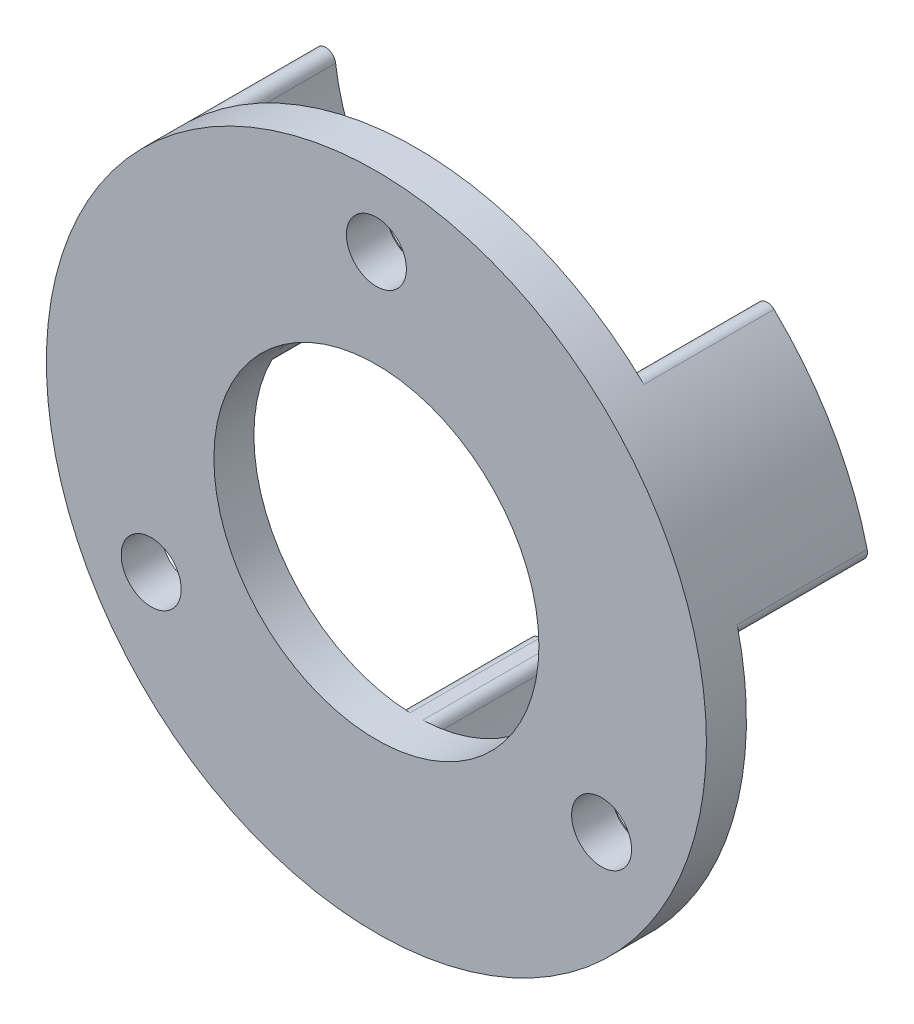
ISO-10303-21;
HEADER;
FILE_DESCRIPTION(('STEP AP214'),'2;1');
FILE_NAME('part.step','',(''),(''),'','','');
FILE_SCHEMA(('AUTOMOTIVE_DESIGN { 1 0 10303 214 1 1 1 1 }'));
ENDSEC;
DATA;
#1=APPLICATION_CONTEXT('core data for automotive mechanical design processes');
#2=APPLICATION_PROTOCOL_DEFINITION('international standard','automotive_design',2000,#1);
#3=PRODUCT_CONTEXT('',#1,'mechanical');
#4=PRODUCT('Part','Part','',(#3));
#5=PRODUCT_RELATED_PRODUCT_CATEGORY('part','',(#4));
#6=PRODUCT_DEFINITION_FORMATION('','',#4);
#7=PRODUCT_DEFINITION_CONTEXT('part definition',#1,'design');
#8=PRODUCT_DEFINITION('design','',#6,#7);
#9=PRODUCT_DEFINITION_SHAPE('','',#8);
#10=(LENGTH_UNIT() NAMED_UNIT(*) SI_UNIT(.MILLI.,.METRE.));
#11=(NAMED_UNIT(*) PLANE_ANGLE_UNIT() SI_UNIT($,.RADIAN.));
#12=(NAMED_UNIT(*) SI_UNIT($,.STERADIAN.) SOLID_ANGLE_UNIT());
#13=UNCERTAINTY_MEASURE_WITH_UNIT(LENGTH_MEASURE(1.E-05),#10,'distance_accuracy_value','');
#14=(GEOMETRIC_REPRESENTATION_CONTEXT(3) GLOBAL_UNCERTAINTY_ASSIGNED_CONTEXT((#13)) GLOBAL_UNIT_ASSIGNED_CONTEXT((#10,
#11,#12)) REPRESENTATION_CONTEXT('',''));
#15=CARTESIAN_POINT('',(0.,0.,0.));
#16=DIRECTION('',(0.,0.,1.));
#17=DIRECTION('',(1.,0.,0.));
#18=AXIS2_PLACEMENT_3D('',#15,#16,#17);
#19=CARTESIAN_POINT('',(0.,-8.95,13.));
#20=DIRECTION('',(0.,0.,-1.));
#21=DIRECTION('',(0.,-1.,0.));
#22=AXIS2_PLACEMENT_3D('',#19,#20,#21);
#23=PLANE('',#22);
#24=CARTESIAN_POINT('',(0.,-26.,13.));
#25=DIRECTION('',(0.,0.,-1.));
#26=DIRECTION('',(-1.,0.,0.));
#27=AXIS2_PLACEMENT_3D('',#24,#25,#26);
#28=CIRCLE('',#27,2.1);
#29=CARTESIAN_POINT('',(-2.1,-26.,13.));
#30=VERTEX_POINT('',#29);
#31=EDGE_CURVE('E11',#30,#30,#28,.T.);
#32=ORIENTED_EDGE('',*,*,#31,.T.);
#33=EDGE_LOOP('',(#32));
#34=FACE_BOUND('',#33,.T.);
#35=ADVANCED_FACE('F17',(#34),#23,.T.);
#36=CARTESIAN_POINT('',(0.,-26.,13.));
#37=DIRECTION('',(0.,0.,-1.));
#38=DIRECTION('',(-1.,0.,0.));
#39=AXIS2_PLACEMENT_3D('',#36,#37,#38);
#40=CYLINDRICAL_SURFACE('',#39,2.1);
#41=CARTESIAN_POINT('',(0.,-26.,5.));
#42=DIRECTION('',(0.,0.,-1.));
#43=DIRECTION('',(-1.,0.,0.));
#44=AXIS2_PLACEMENT_3D('',#41,#42,#43);
#45=CIRCLE('',#44,2.1);
#46=CARTESIAN_POINT('',(-2.1,-26.,5.));
#47=VERTEX_POINT('',#46);
#48=EDGE_CURVE('E293',#47,#47,#45,.T.);
#49=ORIENTED_EDGE('',*,*,#48,.T.);
#50=EDGE_LOOP('',(#49));
#51=FACE_BOUND('',#50,.T.);
#52=ORIENTED_EDGE('',*,*,#31,.F.);
#53=EDGE_LOOP('',(#52));
#54=FACE_BOUND('',#53,.T.);
#55=ADVANCED_FACE('F755',(#51,#54),#40,.F.);
#56=CARTESIAN_POINT('',(0.,-8.95,13.));
#57=DIRECTION('',(0.,0.,-1.));
#58=DIRECTION('',(0.,-1.,0.));
#59=AXIS2_PLACEMENT_3D('',#56,#57,#58);
#60=PLANE('',#59);
#61=CARTESIAN_POINT('',(-22.5166604983954,13.,13.));
#62=DIRECTION('',(0.,0.,-1.));
#63=DIRECTION('',(-1.,0.,0.));
#64=AXIS2_PLACEMENT_3D('',#61,#62,#63);
#65=CIRCLE('',#64,2.1);
#66=CARTESIAN_POINT('',(-24.6166604983954,13.,13.));
#67=VERTEX_POINT('',#66);
#68=EDGE_CURVE('E27',#67,#67,#65,.T.);
#69=ORIENTED_EDGE('',*,*,#68,.T.);
#70=EDGE_LOOP('',(#69));
#71=FACE_BOUND('',#70,.T.);
#72=ADVANCED_FACE('F761',(#71),#60,.T.);
#73=CARTESIAN_POINT('',(-22.5166604983954,13.,13.));
#74=DIRECTION('',(0.,0.,-1.));
#75=DIRECTION('',(-1.,0.,0.));
#76=AXIS2_PLACEMENT_3D('',#73,#74,#75);
#77=CYLINDRICAL_SURFACE('',#76,2.1);
#78=CARTESIAN_POINT('',(-22.5166604983954,13.,5.));
#79=DIRECTION('',(0.,0.,-1.));
#80=DIRECTION('',(-1.,0.,0.));
#81=AXIS2_PLACEMENT_3D('',#78,#79,#80);
#82=CIRCLE('',#81,2.1);
#83=CARTESIAN_POINT('',(-24.6166604983954,13.,5.));
#84=VERTEX_POINT('',#83);
#85=EDGE_CURVE('E462',#84,#84,#82,.T.);
#86=ORIENTED_EDGE('',*,*,#85,.T.);
#87=EDGE_LOOP('',(#86));
#88=FACE_BOUND('',#87,.T.);
#89=ORIENTED_EDGE('',*,*,#68,.F.);
#90=EDGE_LOOP('',(#89));
#91=FACE_BOUND('',#90,.T.);
#92=ADVANCED_FACE('F825',(#88,#91),#77,.F.);
#93=CARTESIAN_POINT('',(0.,-8.95,13.));
#94=DIRECTION('',(0.,0.,-1.));
#95=DIRECTION('',(0.,-1.,0.));
#96=AXIS2_PLACEMENT_3D('',#93,#94,#95);
#97=PLANE('',#96);
#98=CARTESIAN_POINT('',(22.5166604983954,13.,13.));
#99=DIRECTION('',(0.,0.,-1.));
#100=DIRECTION('',(-1.,0.,0.));
#101=AXIS2_PLACEMENT_3D('',#98,#99,#100);
#102=CIRCLE('',#101,2.1);
#103=CARTESIAN_POINT('',(20.4166604983954,13.,13.));
#104=VERTEX_POINT('',#103);
#105=EDGE_CURVE('E611',#104,#104,#102,.T.);
#106=ORIENTED_EDGE('',*,*,#105,.T.);
#107=EDGE_LOOP('',(#106));
#108=FACE_BOUND('',#107,.T.);
#109=ADVANCED_FACE('F839',(#108),#97,.T.);
#110=CARTESIAN_POINT('',(22.5166604983954,13.,13.));
#111=DIRECTION('',(0.,0.,-1.));
#112=DIRECTION('',(-1.,0.,0.));
#113=AXIS2_PLACEMENT_3D('',#110,#111,#112);
#114=CYLINDRICAL_SURFACE('',#113,2.1);
#115=CARTESIAN_POINT('',(22.5166604983954,13.,5.));
#116=DIRECTION('',(0.,0.,-1.));
#117=DIRECTION('',(-1.,0.,0.));
#118=AXIS2_PLACEMENT_3D('',#115,#116,#117);
#119=CIRCLE('',#118,2.1);
#120=CARTESIAN_POINT('',(20.4166604983954,13.,5.));
#121=VERTEX_POINT('',#120);
#122=EDGE_CURVE('E97',#121,#121,#119,.T.);
#123=ORIENTED_EDGE('',*,*,#122,.T.);
#124=EDGE_LOOP('',(#123));
#125=FACE_BOUND('',#124,.T.);
#126=ORIENTED_EDGE('',*,*,#105,.F.);
#127=EDGE_LOOP('',(#126));
#128=FACE_BOUND('',#127,.T.);
#129=ADVANCED_FACE('F797',(#125,#128),#114,.F.);
#130=CARTESIAN_POINT('',(0.,0.,22.));
#131=DIRECTION('',(0.,0.,1.));
#132=DIRECTION('',(1.,0.,0.));
#133=AXIS2_PLACEMENT_3D('',#130,#131,#132);
#134=PLANE('',#133);
#135=CARTESIAN_POINT('',(-22.5166604983954,-13.,22.));
#136=DIRECTION('',(0.,0.,1.));
#137=DIRECTION('',(1.,0.,0.));
#138=AXIS2_PLACEMENT_3D('',#135,#136,#137);
#139=CIRCLE('',#138,3.);
#140=CARTESIAN_POINT('',(-19.5166604983954,-13.,22.));
#141=VERTEX_POINT('',#140);
#142=EDGE_CURVE('E528',#141,#141,#139,.T.);
#143=ORIENTED_EDGE('',*,*,#142,.F.);
#144=EDGE_LOOP('',(#143));
#145=FACE_BOUND('',#144,.T.);
#146=CARTESIAN_POINT('',(0.,26.,22.));
#147=DIRECTION('',(0.,0.,1.));
#148=DIRECTION('',(1.,0.,0.));
#149=AXIS2_PLACEMENT_3D('',#146,#147,#148);
#150=CIRCLE('',#149,3.);
#151=CARTESIAN_POINT('',(3.,26.,22.));
#152=VERTEX_POINT('',#151);
#153=EDGE_CURVE('E84',#152,#152,#150,.T.);
#154=ORIENTED_EDGE('',*,*,#153,.F.);
#155=EDGE_LOOP('',(#154));
#156=FACE_BOUND('',#155,.T.);
#157=CARTESIAN_POINT('',(22.5166604983954,-13.,22.));
#158=DIRECTION('',(0.,0.,1.));
#159=DIRECTION('',(1.,0.,0.));
#160=AXIS2_PLACEMENT_3D('',#157,#158,#159);
#161=CIRCLE('',#160,3.);
#162=CARTESIAN_POINT('',(25.5166604983954,-13.,22.));
#163=VERTEX_POINT('',#162);
#164=EDGE_CURVE('E418',#163,#163,#161,.T.);
#165=ORIENTED_EDGE('',*,*,#164,.F.);
#166=EDGE_LOOP('',(#165));
#167=FACE_BOUND('',#166,.T.);
#168=CARTESIAN_POINT('',(0.,0.,22.));
#169=DIRECTION('',(0.,0.,1.));
#170=DIRECTION('',(1.,0.,0.));
#171=AXIS2_PLACEMENT_3D('',#168,#169,#170);
#172=CIRCLE('',#171,16.25);
#173=CARTESIAN_POINT('',(16.25,0.,22.));
#174=VERTEX_POINT('',#173);
#175=EDGE_CURVE('E437',#174,#174,#172,.T.);
#176=ORIENTED_EDGE('',*,*,#175,.F.);
#177=EDGE_LOOP('',(#176));
#178=FACE_BOUND('',#177,.T.);
#179=CARTESIAN_POINT('',(0.,0.,22.));
#180=DIRECTION('',(0.,0.,1.));
#181=DIRECTION('',(1.,0.,0.));
#182=AXIS2_PLACEMENT_3D('',#179,#180,#181);
#183=CIRCLE('',#182,33.);
#184=CARTESIAN_POINT('',(33.,0.,22.));
#185=VERTEX_POINT('',#184);
#186=EDGE_CURVE('E515',#185,#185,#183,.T.);
#187=ORIENTED_EDGE('',*,*,#186,.T.);
#188=EDGE_LOOP('',(#187));
#189=FACE_BOUND('',#188,.T.);
#190=ADVANCED_FACE('F781',(#145,#156,#167,#178,#189),#134,.T.);
#191=CARTESIAN_POINT('',(-22.5166604983954,-13.,22.));
#192=DIRECTION('',(0.,0.,-1.));
#193=DIRECTION('',(-1.,0.,0.));
#194=AXIS2_PLACEMENT_3D('',#191,#192,#193);
#195=CYLINDRICAL_SURFACE('',#194,3.);
#196=CARTESIAN_POINT('',(-22.5166604983954,-13.,18.));
#197=DIRECTION('',(0.,0.,1.));
#198=DIRECTION('',(1.,0.,0.));
#199=AXIS2_PLACEMENT_3D('',#196,#197,#198);
#200=CIRCLE('',#199,3.);
#201=CARTESIAN_POINT('',(-19.5166604983954,-13.,18.));
#202=VERTEX_POINT('',#201);
#203=EDGE_CURVE('E393',#202,#202,#200,.T.);
#204=ORIENTED_EDGE('',*,*,#203,.F.);
#205=EDGE_LOOP('',(#204));
#206=FACE_BOUND('',#205,.T.);
#207=ORIENTED_EDGE('',*,*,#142,.T.);
#208=EDGE_LOOP('',(#207));
#209=FACE_BOUND('',#208,.T.);
#210=ADVANCED_FACE('F778',(#206,#209),#195,.F.);
#211=CARTESIAN_POINT('',(22.5166604983954,-13.,22.));
#212=DIRECTION('',(0.,0.,-1.));
#213=DIRECTION('',(-1.,0.,0.));
#214=AXIS2_PLACEMENT_3D('',#211,#212,#213);
#215=CYLINDRICAL_SURFACE('',#214,3.);
#216=CARTESIAN_POINT('',(22.5166604983954,-13.,18.));
#217=DIRECTION('',(0.,0.,1.));
#218=DIRECTION('',(1.,0.,0.));
#219=AXIS2_PLACEMENT_3D('',#216,#217,#218);
#220=CIRCLE('',#219,3.);
#221=CARTESIAN_POINT('',(25.5166604983954,-13.,18.));
#222=VERTEX_POINT('',#221);
#223=EDGE_CURVE('E567',#222,#222,#220,.T.);
#224=ORIENTED_EDGE('',*,*,#223,.F.);
#225=EDGE_LOOP('',(#224));
#226=FACE_BOUND('',#225,.T.);
#227=ORIENTED_EDGE('',*,*,#164,.T.);
#228=EDGE_LOOP('',(#227));
#229=FACE_BOUND('',#228,.T.);
#230=ADVANCED_FACE('F780',(#226,#229),#215,.F.);
#231=CARTESIAN_POINT('',(0.,26.,22.));
#232=DIRECTION('',(0.,0.,-1.));
#233=DIRECTION('',(-1.,0.,0.));
#234=AXIS2_PLACEMENT_3D('',#231,#232,#233);
#235=CYLINDRICAL_SURFACE('',#234,3.);
#236=CARTESIAN_POINT('',(0.,26.,18.));
#237=DIRECTION('',(0.,0.,1.));
#238=DIRECTION('',(1.,0.,0.));
#239=AXIS2_PLACEMENT_3D('',#236,#237,#238);
#240=CIRCLE('',#239,3.);
#241=CARTESIAN_POINT('',(3.,26.,18.));
#242=VERTEX_POINT('',#241);
#243=EDGE_CURVE('E438',#242,#242,#240,.T.);
#244=ORIENTED_EDGE('',*,*,#243,.F.);
#245=EDGE_LOOP('',(#244));
#246=FACE_BOUND('',#245,.T.);
#247=ORIENTED_EDGE('',*,*,#153,.T.);
#248=EDGE_LOOP('',(#247));
#249=FACE_BOUND('',#248,.T.);
#250=ADVANCED_FACE('F820',(#246,#249),#235,.F.);
#251=CARTESIAN_POINT('',(14.590651516858,9.20192307692308,18.));
#252=DIRECTION('',(0.,0.,-1.));
#253=DIRECTION('',(-1.,0.,0.));
#254=AXIS2_PLACEMENT_3D('',#251,#252,#253);
#255=CYLINDRICAL_SURFACE('',#254,1.);
#256=CARTESIAN_POINT('',(14.590651516858,9.20192307692308,18.));
#257=DIRECTION('',(0.,0.,1.));
#258=DIRECTION('',(1.,0.,0.));
#259=AXIS2_PLACEMENT_3D('',#256,#257,#258);
#260=CIRCLE('',#259,1.);
#261=CARTESIAN_POINT('',(13.9348918981228,9.95689282627485,18.));
#262=VERTEX_POINT('',#261);
#263=CARTESIAN_POINT('',(13.7448166463155,8.66847826086957,18.));
#264=VERTEX_POINT('',#263);
#265=EDGE_CURVE('E542',#262,#264,#260,.T.);
#266=ORIENTED_EDGE('',*,*,#265,.F.);
#267=DIRECTION('',(0.,0.,1.));
#268=VECTOR('',#267,1.);
#269=CARTESIAN_POINT('',(13.9348918981228,9.95689282627485,18.));
#270=LINE('',#269,#268);
#271=CARTESIAN_POINT('',(13.9348918981228,9.95689282627485,5.));
#272=VERTEX_POINT('',#271);
#273=EDGE_CURVE('E328',#272,#262,#270,.T.);
#274=ORIENTED_EDGE('',*,*,#273,.F.);
#275=CARTESIAN_POINT('',(14.590651516858,9.20192307692308,5.));
#276=DIRECTION('',(0.,0.,-1.));
#277=DIRECTION('',(1.,0.,0.));
#278=AXIS2_PLACEMENT_3D('',#275,#276,#277);
#279=CIRCLE('',#278,1.);
#280=CARTESIAN_POINT('',(13.7448166463155,8.66847826086957,5.));
#281=VERTEX_POINT('',#280);
#282=EDGE_CURVE('E415',#281,#272,#279,.T.);
#283=ORIENTED_EDGE('',*,*,#282,.F.);
#284=DIRECTION('',(0.,0.,-1.));
#285=VECTOR('',#284,1.);
#286=CARTESIAN_POINT('',(13.7448166463155,8.66847826086957,18.));
#287=LINE('',#286,#285);
#288=EDGE_CURVE('E329',#264,#281,#287,.T.);
#289=ORIENTED_EDGE('',*,*,#288,.F.);
#290=EDGE_LOOP('',(#266,#274,#283,#289));
#291=FACE_BOUND('',#290,.T.);
#292=ADVANCED_FACE('F636',(#291),#255,.T.);
#293=CARTESIAN_POINT('',(22.0695312361721,23.171875,18.));
#294=DIRECTION('',(0.,0.,1.));
#295=DIRECTION('',(1.,0.,0.));
#296=AXIS2_PLACEMENT_3D('',#293,#294,#295);
#297=CYLINDRICAL_SURFACE('',#296,1.);
#298=CARTESIAN_POINT('',(22.0695312361721,23.171875,18.));
#299=DIRECTION('',(0.,0.,1.));
#300=DIRECTION('',(1.,0.,0.));
#301=AXIS2_PLACEMENT_3D('',#298,#299,#300);
#302=CIRCLE('',#301,1.);
#303=CARTESIAN_POINT('',(22.7592040873025,23.89599609375,18.));
#304=VERTEX_POINT('',#303);
#305=CARTESIAN_POINT('',(21.0776421918497,23.298981741573,18.));
#306=VERTEX_POINT('',#305);
#307=EDGE_CURVE('E441',#304,#306,#302,.T.);
#308=ORIENTED_EDGE('',*,*,#307,.F.);
#309=DIRECTION('',(0.,0.,1.));
#310=VECTOR('',#309,1.);
#311=CARTESIAN_POINT('',(22.7592040873025,23.89599609375,18.));
#312=LINE('',#311,#310);
#313=CARTESIAN_POINT('',(22.7592040873025,23.89599609375,5.));
#314=VERTEX_POINT('',#313);
#315=EDGE_CURVE('E385',#314,#304,#312,.T.);
#316=ORIENTED_EDGE('',*,*,#315,.F.);
#317=CARTESIAN_POINT('',(22.0695312361721,23.171875,5.));
#318=DIRECTION('',(0.,0.,-1.));
#319=DIRECTION('',(1.,0.,0.));
#320=AXIS2_PLACEMENT_3D('',#317,#318,#319);
#321=CIRCLE('',#320,1.);
#322=CARTESIAN_POINT('',(21.0776421918497,23.298981741573,5.));
#323=VERTEX_POINT('',#322);
#324=EDGE_CURVE('E412',#323,#314,#321,.T.);
#325=ORIENTED_EDGE('',*,*,#324,.F.);
#326=DIRECTION('',(0.,0.,-1.));
#327=VECTOR('',#326,1.);
#328=CARTESIAN_POINT('',(21.0776421918497,23.298981741573,18.));
#329=LINE('',#328,#327);
#330=EDGE_CURVE('E526',#306,#323,#329,.T.);
#331=ORIENTED_EDGE('',*,*,#330,.F.);
#332=EDGE_LOOP('',(#308,#316,#325,#331));
#333=FACE_BOUND('',#332,.T.);
#334=ADVANCED_FACE('F649',(#333),#297,.T.);
#335=CARTESIAN_POINT('',(15.2644249067146,8.03491333290344,18.));
#336=DIRECTION('',(0.,0.,-1.));
#337=DIRECTION('',(-1.,0.,0.));
#338=AXIS2_PLACEMENT_3D('',#335,#336,#337);
#339=CYLINDRICAL_SURFACE('',#338,1.);
#340=CARTESIAN_POINT('',(15.2644249067146,8.03491333290344,18.));
#341=DIRECTION('',(0.,0.,1.));
#342=DIRECTION('',(1.,0.,0.));
#343=AXIS2_PLACEMENT_3D('',#340,#341,#342);
#344=CIRCLE('',#343,1.);
#345=CARTESIAN_POINT('',(14.3795307092239,7.56912125563368,18.));
#346=VERTEX_POINT('',#345);
#347=CARTESIAN_POINT('',(15.5903680793744,7.08952396962688,18.));
#348=VERTEX_POINT('',#347);
#349=EDGE_CURVE('E424',#346,#348,#344,.T.);
#350=ORIENTED_EDGE('',*,*,#349,.F.);
#351=DIRECTION('',(0.,0.,1.));
#352=VECTOR('',#351,1.);
#353=CARTESIAN_POINT('',(14.3795307092239,7.56912125563368,18.));
#354=LINE('',#353,#352);
#355=CARTESIAN_POINT('',(14.3795307092239,7.56912125563368,5.));
#356=VERTEX_POINT('',#355);
#357=EDGE_CURVE('E335',#356,#346,#354,.T.);
#358=ORIENTED_EDGE('',*,*,#357,.F.);
#359=CARTESIAN_POINT('',(15.2644249067146,8.03491333290344,5.));
#360=DIRECTION('',(0.,0.,-1.));
#361=DIRECTION('',(1.,0.,0.));
#362=AXIS2_PLACEMENT_3D('',#359,#360,#361);
#363=CIRCLE('',#362,1.);
#364=CARTESIAN_POINT('',(15.5903680793744,7.08952396962688,5.));
#365=VERTEX_POINT('',#364);
#366=EDGE_CURVE('E501',#365,#356,#363,.T.);
#367=ORIENTED_EDGE('',*,*,#366,.F.);
#368=DIRECTION('',(0.,0.,-1.));
#369=VECTOR('',#368,1.);
#370=CARTESIAN_POINT('',(15.5903680793744,7.08952396962688,18.));
#371=LINE('',#370,#369);
#372=EDGE_CURVE('E372',#348,#365,#371,.T.);
#373=ORIENTED_EDGE('',*,*,#372,.F.);
#374=EDGE_LOOP('',(#350,#358,#367,#373));
#375=FACE_BOUND('',#374,.T.);
#376=ADVANCED_FACE('F829',(#375),#339,.T.);
#377=CARTESIAN_POINT('',(31.1021980214036,7.52683720013921,18.));
#378=DIRECTION('',(0.,0.,1.));
#379=DIRECTION('',(1.,0.,0.));
#380=AXIS2_PLACEMENT_3D('',#377,#378,#379);
#381=CYLINDRICAL_SURFACE('',#380,1.);
#382=CARTESIAN_POINT('',(31.1021980214036,7.52683720013921,18.));
#383=DIRECTION('',(0.,0.,1.));
#384=DIRECTION('',(1.,0.,0.));
#385=AXIS2_PLACEMENT_3D('',#382,#383,#384);
#386=CIRCLE('',#385,1.);
#387=CARTESIAN_POINT('',(30.7163311664369,6.60428271923408,18.));
#388=VERTEX_POINT('',#387);
#389=CARTESIAN_POINT('',(32.0741417095724,7.76205086264356,18.));
#390=VERTEX_POINT('',#389);
#391=EDGE_CURVE('E423',#388,#390,#386,.T.);
#392=ORIENTED_EDGE('',*,*,#391,.F.);
#393=DIRECTION('',(0.,0.,1.));
#394=VECTOR('',#393,1.);
#395=CARTESIAN_POINT('',(30.7163311664369,6.60428271923408,18.));
#396=LINE('',#395,#394);
#397=CARTESIAN_POINT('',(30.7163311664369,6.60428271923408,5.));
#398=VERTEX_POINT('',#397);
#399=EDGE_CURVE('E327',#398,#388,#396,.T.);
#400=ORIENTED_EDGE('',*,*,#399,.F.);
#401=CARTESIAN_POINT('',(31.1021980214036,7.52683720013921,5.));
#402=DIRECTION('',(0.,0.,-1.));
#403=DIRECTION('',(1.,0.,0.));
#404=AXIS2_PLACEMENT_3D('',#401,#402,#403);
#405=CIRCLE('',#404,1.);
#406=CARTESIAN_POINT('',(32.0741417095724,7.76205086264356,5.));
#407=VERTEX_POINT('',#406);
#408=EDGE_CURVE('E495',#407,#398,#405,.T.);
#409=ORIENTED_EDGE('',*,*,#408,.F.);
#410=DIRECTION('',(0.,0.,-1.));
#411=VECTOR('',#410,1.);
#412=CARTESIAN_POINT('',(32.0741417095724,7.76205086264356,18.));
#413=LINE('',#412,#411);
#414=EDGE_CURVE('E342',#390,#407,#413,.T.);
#415=ORIENTED_EDGE('',*,*,#414,.F.);
#416=EDGE_LOOP('',(#392,#400,#409,#415));
#417=FACE_BOUND('',#416,.T.);
#418=ADVANCED_FACE('F654',(#417),#381,.T.);
#419=CARTESIAN_POINT('',(0.,6.5,5.));
#420=DIRECTION('',(0.,0.,1.));
#421=DIRECTION('',(1.,0.,0.));
#422=AXIS2_PLACEMENT_3D('',#419,#420,#421);
#423=PLANE('',#422);
#424=CARTESIAN_POINT('',(0.,0.,5.));
#425=DIRECTION('',(0.,0.,1.));
#426=DIRECTION('',(1.,0.,0.));
#427=AXIS2_PLACEMENT_3D('',#424,#425,#426);
#428=CIRCLE('',#427,33.);
#429=EDGE_CURVE('E352',#407,#314,#428,.T.);
#430=ORIENTED_EDGE('',*,*,#429,.F.);
#431=ORIENTED_EDGE('',*,*,#408,.T.);
#432=CARTESIAN_POINT('',(22.5166604983954,-13.,5.));
#433=DIRECTION('',(0.,0.,1.));
#434=DIRECTION('',(1.,0.,0.));
#435=AXIS2_PLACEMENT_3D('',#432,#433,#434);
#436=CIRCLE('',#435,21.25);
#437=EDGE_CURVE('E323',#398,#365,#436,.T.);
#438=ORIENTED_EDGE('',*,*,#437,.T.);
#439=ORIENTED_EDGE('',*,*,#366,.T.);
#440=CARTESIAN_POINT('',(0.,0.,5.));
#441=DIRECTION('',(0.,0.,1.));
#442=DIRECTION('',(1.,0.,0.));
#443=AXIS2_PLACEMENT_3D('',#440,#441,#442);
#444=CIRCLE('',#443,16.25);
#445=EDGE_CURVE('E333',#356,#281,#444,.T.);
#446=ORIENTED_EDGE('',*,*,#445,.T.);
#447=ORIENTED_EDGE('',*,*,#282,.T.);
#448=CARTESIAN_POINT('',(0.,26.,5.));
#449=DIRECTION('',(0.,0.,1.));
#450=DIRECTION('',(1.,0.,0.));
#451=AXIS2_PLACEMENT_3D('',#448,#449,#450);
#452=CIRCLE('',#451,21.25);
#453=EDGE_CURVE('E461',#272,#323,#452,.T.);
#454=ORIENTED_EDGE('',*,*,#453,.T.);
#455=ORIENTED_EDGE('',*,*,#324,.T.);
#456=EDGE_LOOP('',(#430,#431,#438,#439,#446,#447,#454,#455));
#457=FACE_BOUND('',#456,.T.);
#458=ORIENTED_EDGE('',*,*,#122,.F.);
#459=EDGE_LOOP('',(#458));
#460=FACE_BOUND('',#459,.T.);
#461=ADVANCED_FACE('F628',(#457,#460),#423,.F.);
#462=CARTESIAN_POINT('',(22.5166604983954,-13.,18.));
#463=DIRECTION('',(0.,0.,-1.));
#464=DIRECTION('',(-1.,0.,0.));
#465=AXIS2_PLACEMENT_3D('',#462,#463,#464);
#466=CYLINDRICAL_SURFACE('',#465,21.25);
#467=ORIENTED_EDGE('',*,*,#437,.F.);
#468=ORIENTED_EDGE('',*,*,#399,.T.);
#469=CARTESIAN_POINT('',(22.5166604983954,-13.,18.));
#470=DIRECTION('',(0.,0.,1.));
#471=DIRECTION('',(1.,0.,0.));
#472=AXIS2_PLACEMENT_3D('',#469,#470,#471);
#473=CIRCLE('',#472,21.25);
#474=EDGE_CURVE('E419',#388,#348,#473,.T.);
#475=ORIENTED_EDGE('',*,*,#474,.T.);
#476=ORIENTED_EDGE('',*,*,#372,.T.);
#477=EDGE_LOOP('',(#467,#468,#475,#476));
#478=FACE_BOUND('',#477,.T.);
#479=ADVANCED_FACE('F814',(#478),#466,.F.);
#480=CARTESIAN_POINT('',(0.,26.,18.));
#481=DIRECTION('',(0.,0.,-1.));
#482=DIRECTION('',(-1.,0.,0.));
#483=AXIS2_PLACEMENT_3D('',#480,#481,#482);
#484=CYLINDRICAL_SURFACE('',#483,21.25);
#485=CARTESIAN_POINT('',(0.,26.,18.));
#486=DIRECTION('',(0.,0.,1.));
#487=DIRECTION('',(1.,0.,0.));
#488=AXIS2_PLACEMENT_3D('',#485,#486,#487);
#489=CIRCLE('',#488,21.25);
#490=EDGE_CURVE('E487',#262,#306,#489,.T.);
#491=ORIENTED_EDGE('',*,*,#490,.T.);
#492=ORIENTED_EDGE('',*,*,#330,.T.);
#493=ORIENTED_EDGE('',*,*,#453,.F.);
#494=ORIENTED_EDGE('',*,*,#273,.T.);
#495=EDGE_LOOP('',(#491,#492,#493,#494));
#496=FACE_BOUND('',#495,.T.);
#497=ADVANCED_FACE('F645',(#496),#484,.F.);
#498=CARTESIAN_POINT('',(0.,0.,18.));
#499=DIRECTION('',(0.,0.,1.));
#500=DIRECTION('',(1.,0.,0.));
#501=AXIS2_PLACEMENT_3D('',#498,#499,#500);
#502=PLANE('',#501);
#503=CARTESIAN_POINT('',(0.,26.,18.));
#504=DIRECTION('',(0.,0.,1.));
#505=DIRECTION('',(1.,0.,0.));
#506=AXIS2_PLACEMENT_3D('',#503,#504,#505);
#507=CIRCLE('',#506,21.25);
#508=CARTESIAN_POINT('',(-21.0776421918497,23.298981741573,18.));
#509=VERTEX_POINT('',#508);
#510=CARTESIAN_POINT('',(-13.9348918981228,9.95689282627485,18.));
#511=VERTEX_POINT('',#510);
#512=EDGE_CURVE('E406',#509,#511,#507,.T.);
#513=ORIENTED_EDGE('',*,*,#512,.F.);
#514=CARTESIAN_POINT('',(-22.0695312361721,23.171875,18.));
#515=DIRECTION('',(0.,0.,1.));
#516=DIRECTION('',(1.,0.,0.));
#517=AXIS2_PLACEMENT_3D('',#514,#515,#516);
#518=CIRCLE('',#517,1.);
#519=CARTESIAN_POINT('',(-22.7592040873025,23.89599609375,18.));
#520=VERTEX_POINT('',#519);
#521=EDGE_CURVE('E368',#509,#520,#518,.T.);
#522=ORIENTED_EDGE('',*,*,#521,.T.);
#523=CARTESIAN_POINT('',(0.,0.,18.));
#524=DIRECTION('',(0.,0.,1.));
#525=DIRECTION('',(1.,0.,0.));
#526=AXIS2_PLACEMENT_3D('',#523,#524,#525);
#527=CIRCLE('',#526,33.);
#528=EDGE_CURVE('E430',#304,#520,#527,.T.);
#529=ORIENTED_EDGE('',*,*,#528,.F.);
#530=ORIENTED_EDGE('',*,*,#307,.T.);
#531=ORIENTED_EDGE('',*,*,#490,.F.);
#532=ORIENTED_EDGE('',*,*,#265,.T.);
#533=CARTESIAN_POINT('',(0.,0.,18.));
#534=DIRECTION('',(0.,0.,1.));
#535=DIRECTION('',(1.,0.,0.));
#536=AXIS2_PLACEMENT_3D('',#533,#534,#535);
#537=CIRCLE('',#536,16.25);
#538=CARTESIAN_POINT('',(-13.7448166463155,8.66847826086957,18.));
#539=VERTEX_POINT('',#538);
#540=EDGE_CURVE('E334',#264,#539,#537,.T.);
#541=ORIENTED_EDGE('',*,*,#540,.T.);
#542=CARTESIAN_POINT('',(-14.590651516858,9.20192307692308,18.));
#543=DIRECTION('',(0.,0.,1.));
#544=DIRECTION('',(1.,0.,0.));
#545=AXIS2_PLACEMENT_3D('',#542,#543,#544);
#546=CIRCLE('',#545,1.);
#547=EDGE_CURVE('E442',#539,#511,#546,.T.);
#548=ORIENTED_EDGE('',*,*,#547,.T.);
#549=EDGE_LOOP('',(#513,#522,#529,#530,#531,#532,#541,#548));
#550=FACE_BOUND('',#549,.T.);
#551=ORIENTED_EDGE('',*,*,#243,.T.);
#552=EDGE_LOOP('',(#551));
#553=FACE_BOUND('',#552,.T.);
#554=ADVANCED_FACE('F641',(#550,#553),#502,.F.);
#555=CARTESIAN_POINT('',(-31.1021980214036,7.52683720013921,18.));
#556=DIRECTION('',(0.,0.,1.));
#557=DIRECTION('',(1.,0.,0.));
#558=AXIS2_PLACEMENT_3D('',#555,#556,#557);
#559=CYLINDRICAL_SURFACE('',#558,1.);
#560=CARTESIAN_POINT('',(-31.1021980214036,7.52683720013921,18.));
#561=DIRECTION('',(0.,0.,1.));
#562=DIRECTION('',(1.,0.,0.));
#563=AXIS2_PLACEMENT_3D('',#560,#561,#562);
#564=CIRCLE('',#563,1.);
#565=CARTESIAN_POINT('',(-32.0741417095724,7.76205086264356,18.));
#566=VERTEX_POINT('',#565);
#567=CARTESIAN_POINT('',(-30.716331166437,6.60428271923407,18.));
#568=VERTEX_POINT('',#567);
#569=EDGE_CURVE('E407',#566,#568,#564,.T.);
#570=ORIENTED_EDGE('',*,*,#569,.F.);
#571=DIRECTION('',(0.,0.,1.));
#572=VECTOR('',#571,1.);
#573=CARTESIAN_POINT('',(-32.0741417095724,7.76205086264355,18.));
#574=LINE('',#573,#572);
#575=CARTESIAN_POINT('',(-32.0741417095724,7.76205086264355,5.));
#576=VERTEX_POINT('',#575);
#577=EDGE_CURVE('E396',#576,#566,#574,.T.);
#578=ORIENTED_EDGE('',*,*,#577,.F.);
#579=CARTESIAN_POINT('',(-31.1021980214036,7.52683720013921,5.));
#580=DIRECTION('',(0.,0.,-1.));
#581=DIRECTION('',(1.,0.,0.));
#582=AXIS2_PLACEMENT_3D('',#579,#580,#581);
#583=CIRCLE('',#582,1.);
#584=CARTESIAN_POINT('',(-30.716331166437,6.60428271923407,5.));
#585=VERTEX_POINT('',#584);
#586=EDGE_CURVE('E365',#585,#576,#583,.T.);
#587=ORIENTED_EDGE('',*,*,#586,.F.);
#588=DIRECTION('',(0.,0.,-1.));
#589=VECTOR('',#588,1.);
#590=CARTESIAN_POINT('',(-30.716331166437,6.60428271923408,18.));
#591=LINE('',#590,#589);
#592=EDGE_CURVE('E389',#568,#585,#591,.T.);
#593=ORIENTED_EDGE('',*,*,#592,.F.);
#594=EDGE_LOOP('',(#570,#578,#587,#593));
#595=FACE_BOUND('',#594,.T.);
#596=ADVANCED_FACE('F695',(#595),#559,.T.);
#597=CARTESIAN_POINT('',(-15.2644249067146,8.03491333290344,18.));
#598=DIRECTION('',(0.,0.,-1.));
#599=DIRECTION('',(-1.,0.,0.));
#600=AXIS2_PLACEMENT_3D('',#597,#598,#599);
#601=CYLINDRICAL_SURFACE('',#600,1.);
#602=CARTESIAN_POINT('',(-15.2644249067146,8.03491333290344,18.));
#603=DIRECTION('',(0.,0.,1.));
#604=DIRECTION('',(1.,0.,0.));
#605=AXIS2_PLACEMENT_3D('',#602,#603,#604);
#606=CIRCLE('',#605,1.);
#607=CARTESIAN_POINT('',(-15.5903680793744,7.08952396962688,18.));
#608=VERTEX_POINT('',#607);
#609=CARTESIAN_POINT('',(-14.3795307092239,7.56912125563367,18.));
#610=VERTEX_POINT('',#609);
#611=EDGE_CURVE('E570',#608,#610,#606,.T.);
#612=ORIENTED_EDGE('',*,*,#611,.F.);
#613=DIRECTION('',(0.,0.,1.));
#614=VECTOR('',#613,1.);
#615=CARTESIAN_POINT('',(-15.5903680793744,7.08952396962688,18.));
#616=LINE('',#615,#614);
#617=CARTESIAN_POINT('',(-15.5903680793744,7.08952396962688,5.));
#618=VERTEX_POINT('',#617);
#619=EDGE_CURVE('E386',#618,#608,#616,.T.);
#620=ORIENTED_EDGE('',*,*,#619,.F.);
#621=CARTESIAN_POINT('',(-15.2644249067146,8.03491333290344,5.));
#622=DIRECTION('',(0.,0.,-1.));
#623=DIRECTION('',(1.,0.,0.));
#624=AXIS2_PLACEMENT_3D('',#621,#622,#623);
#625=CIRCLE('',#624,1.);
#626=CARTESIAN_POINT('',(-14.3795307092239,7.56912125563367,5.));
#627=VERTEX_POINT('',#626);
#628=EDGE_CURVE('E369',#627,#618,#625,.T.);
#629=ORIENTED_EDGE('',*,*,#628,.F.);
#630=DIRECTION('',(0.,0.,-1.));
#631=VECTOR('',#630,1.);
#632=CARTESIAN_POINT('',(-14.3795307092239,7.56912125563367,18.));
#633=LINE('',#632,#631);
#634=EDGE_CURVE('E443',#610,#627,#633,.T.);
#635=ORIENTED_EDGE('',*,*,#634,.F.);
#636=EDGE_LOOP('',(#612,#620,#629,#635));
#637=FACE_BOUND('',#636,.T.);
#638=ADVANCED_FACE('F676',(#637),#601,.T.);
#639=CARTESIAN_POINT('',(-14.590651516858,9.20192307692308,18.));
#640=DIRECTION('',(0.,0.,-1.));
#641=DIRECTION('',(-1.,0.,0.));
#642=AXIS2_PLACEMENT_3D('',#639,#640,#641);
#643=CYLINDRICAL_SURFACE('',#642,1.);
#644=ORIENTED_EDGE('',*,*,#547,.F.);
#645=DIRECTION('',(0.,0.,1.));
#646=VECTOR('',#645,1.);
#647=CARTESIAN_POINT('',(-13.7448166463155,8.66847826086957,18.));
#648=LINE('',#647,#646);
#649=CARTESIAN_POINT('',(-13.7448166463155,8.66847826086957,5.));
#650=VERTEX_POINT('',#649);
#651=EDGE_CURVE('E454',#650,#539,#648,.T.);
#652=ORIENTED_EDGE('',*,*,#651,.F.);
#653=CARTESIAN_POINT('',(-14.590651516858,9.20192307692308,5.));
#654=DIRECTION('',(0.,0.,-1.));
#655=DIRECTION('',(1.,0.,0.));
#656=AXIS2_PLACEMENT_3D('',#653,#654,#655);
#657=CIRCLE('',#656,1.);
#658=CARTESIAN_POINT('',(-13.9348918981228,9.95689282627486,5.));
#659=VERTEX_POINT('',#658);
#660=EDGE_CURVE('E457',#659,#650,#657,.T.);
#661=ORIENTED_EDGE('',*,*,#660,.F.);
#662=DIRECTION('',(0.,0.,-1.));
#663=VECTOR('',#662,1.);
#664=CARTESIAN_POINT('',(-13.9348918981228,9.95689282627485,18.));
#665=LINE('',#664,#663);
#666=EDGE_CURVE('E402',#511,#659,#665,.T.);
#667=ORIENTED_EDGE('',*,*,#666,.F.);
#668=EDGE_LOOP('',(#644,#652,#661,#667));
#669=FACE_BOUND('',#668,.T.);
#670=ADVANCED_FACE('F686',(#669),#643,.T.);
#671=CARTESIAN_POINT('',(-22.0695312361721,23.171875,18.));
#672=DIRECTION('',(0.,0.,1.));
#673=DIRECTION('',(1.,0.,0.));
#674=AXIS2_PLACEMENT_3D('',#671,#672,#673);
#675=CYLINDRICAL_SURFACE('',#674,1.);
#676=ORIENTED_EDGE('',*,*,#521,.F.);
#677=DIRECTION('',(0.,0.,1.));
#678=VECTOR('',#677,1.);
#679=CARTESIAN_POINT('',(-21.0776421918497,23.298981741573,18.));
#680=LINE('',#679,#678);
#681=CARTESIAN_POINT('',(-21.0776421918497,23.298981741573,5.));
#682=VERTEX_POINT('',#681);
#683=EDGE_CURVE('E563',#682,#509,#680,.T.);
#684=ORIENTED_EDGE('',*,*,#683,.F.);
#685=CARTESIAN_POINT('',(-22.0695312361721,23.171875,5.));
#686=DIRECTION('',(0.,0.,-1.));
#687=DIRECTION('',(1.,0.,0.));
#688=AXIS2_PLACEMENT_3D('',#685,#686,#687);
#689=CIRCLE('',#688,1.);
#690=CARTESIAN_POINT('',(-22.7592040873025,23.89599609375,5.));
#691=VERTEX_POINT('',#690);
#692=EDGE_CURVE('E464',#691,#682,#689,.T.);
#693=ORIENTED_EDGE('',*,*,#692,.F.);
#694=DIRECTION('',(0.,0.,-1.));
#695=VECTOR('',#694,1.);
#696=CARTESIAN_POINT('',(-22.7592040873025,23.89599609375,18.));
#697=LINE('',#696,#695);
#698=EDGE_CURVE('E434',#520,#691,#697,.T.);
#699=ORIENTED_EDGE('',*,*,#698,.F.);
#700=EDGE_LOOP('',(#676,#684,#693,#699));
#701=FACE_BOUND('',#700,.T.);
#702=ADVANCED_FACE('F692',(#701),#675,.T.);
#703=CARTESIAN_POINT('',(0.,6.5,5.));
#704=DIRECTION('',(0.,0.,1.));
#705=DIRECTION('',(1.,0.,0.));
#706=AXIS2_PLACEMENT_3D('',#703,#704,#705);
#707=PLANE('',#706);
#708=CARTESIAN_POINT('',(0.,0.,5.));
#709=DIRECTION('',(0.,0.,1.));
#710=DIRECTION('',(1.,0.,0.));
#711=AXIS2_PLACEMENT_3D('',#708,#709,#710);
#712=CIRCLE('',#711,33.);
#713=EDGE_CURVE('E401',#691,#576,#712,.T.);
#714=ORIENTED_EDGE('',*,*,#713,.F.);
#715=ORIENTED_EDGE('',*,*,#692,.T.);
#716=CARTESIAN_POINT('',(0.,26.,5.));
#717=DIRECTION('',(0.,0.,1.));
#718=DIRECTION('',(1.,0.,0.));
#719=AXIS2_PLACEMENT_3D('',#716,#717,#718);
#720=CIRCLE('',#719,21.25);
#721=EDGE_CURVE('E520',#682,#659,#720,.T.);
#722=ORIENTED_EDGE('',*,*,#721,.T.);
#723=ORIENTED_EDGE('',*,*,#660,.T.);
#724=CARTESIAN_POINT('',(0.,0.,5.));
#725=DIRECTION('',(0.,0.,1.));
#726=DIRECTION('',(1.,0.,0.));
#727=AXIS2_PLACEMENT_3D('',#724,#725,#726);
#728=CIRCLE('',#727,16.25);
#729=EDGE_CURVE('E447',#650,#627,#728,.T.);
#730=ORIENTED_EDGE('',*,*,#729,.T.);
#731=ORIENTED_EDGE('',*,*,#628,.T.);
#732=CARTESIAN_POINT('',(-22.5166604983954,-13.,5.));
#733=DIRECTION('',(0.,0.,1.));
#734=DIRECTION('',(1.,0.,0.));
#735=AXIS2_PLACEMENT_3D('',#732,#733,#734);
#736=CIRCLE('',#735,21.25);
#737=EDGE_CURVE('E390',#618,#585,#736,.T.);
#738=ORIENTED_EDGE('',*,*,#737,.T.);
#739=ORIENTED_EDGE('',*,*,#586,.T.);
#740=EDGE_LOOP('',(#714,#715,#722,#723,#730,#731,#738,#739));
#741=FACE_BOUND('',#740,.T.);
#742=ORIENTED_EDGE('',*,*,#85,.F.);
#743=EDGE_LOOP('',(#742));
#744=FACE_BOUND('',#743,.T.);
#745=ADVANCED_FACE('F680',(#741,#744),#707,.F.);
#746=CARTESIAN_POINT('',(-22.5166604983954,-13.,18.));
#747=DIRECTION('',(0.,0.,-1.));
#748=DIRECTION('',(-1.,0.,0.));
#749=AXIS2_PLACEMENT_3D('',#746,#747,#748);
#750=CYLINDRICAL_SURFACE('',#749,21.25);
#751=ORIENTED_EDGE('',*,*,#737,.F.);
#752=ORIENTED_EDGE('',*,*,#619,.T.);
#753=CARTESIAN_POINT('',(-22.5166604983954,-13.,18.));
#754=DIRECTION('',(0.,0.,1.));
#755=DIRECTION('',(1.,0.,0.));
#756=AXIS2_PLACEMENT_3D('',#753,#754,#755);
#757=CIRCLE('',#756,21.25);
#758=EDGE_CURVE('E411',#608,#568,#757,.T.);
#759=ORIENTED_EDGE('',*,*,#758,.T.);
#760=ORIENTED_EDGE('',*,*,#592,.T.);
#761=EDGE_LOOP('',(#751,#752,#759,#760));
#762=FACE_BOUND('',#761,.T.);
#763=ADVANCED_FACE('F813',(#762),#750,.F.);
#764=CARTESIAN_POINT('',(0.,26.,18.));
#765=DIRECTION('',(0.,0.,-1.));
#766=DIRECTION('',(-1.,0.,0.));
#767=AXIS2_PLACEMENT_3D('',#764,#765,#766);
#768=CYLINDRICAL_SURFACE('',#767,21.25);
#769=ORIENTED_EDGE('',*,*,#721,.F.);
#770=ORIENTED_EDGE('',*,*,#683,.T.);
#771=ORIENTED_EDGE('',*,*,#512,.T.);
#772=ORIENTED_EDGE('',*,*,#666,.T.);
#773=EDGE_LOOP('',(#769,#770,#771,#772));
#774=FACE_BOUND('',#773,.T.);
#775=ADVANCED_FACE('F690',(#774),#768,.F.);
#776=CARTESIAN_POINT('',(0.,0.,18.));
#777=DIRECTION('',(0.,0.,1.));
#778=DIRECTION('',(1.,0.,0.));
#779=AXIS2_PLACEMENT_3D('',#776,#777,#778);
#780=PLANE('',#779);
#781=CARTESIAN_POINT('',(0.,0.,18.));
#782=DIRECTION('',(0.,0.,1.));
#783=DIRECTION('',(1.,0.,0.));
#784=AXIS2_PLACEMENT_3D('',#781,#782,#783);
#785=CIRCLE('',#784,33.);
#786=CARTESIAN_POINT('',(9.31493762226999,-31.6580469563935,18.));
#787=VERTEX_POINT('',#786);
#788=EDGE_CURVE('E339',#787,#390,#785,.T.);
#789=ORIENTED_EDGE('',*,*,#788,.F.);
#790=CARTESIAN_POINT('',(9.03266678523151,-30.6987122001392,18.));
#791=DIRECTION('',(0.,0.,1.));
#792=DIRECTION('',(1.,0.,0.));
#793=AXIS2_PLACEMENT_3D('',#790,#791,#792);
#794=CIRCLE('',#793,1.);
#795=CARTESIAN_POINT('',(9.63868897458719,-29.9032644608071,18.));
#796=VERTEX_POINT('',#795);
#797=EDGE_CURVE('E377',#787,#796,#794,.T.);
#798=ORIENTED_EDGE('',*,*,#797,.T.);
#799=CARTESIAN_POINT('',(22.5166604983954,-13.,18.));
#800=DIRECTION('',(0.,0.,1.));
#801=DIRECTION('',(1.,0.,0.));
#802=AXIS2_PLACEMENT_3D('',#799,#800,#801);
#803=CIRCLE('',#802,21.25);
#804=CARTESIAN_POINT('',(1.65547618125167,-17.0464167959018,18.));
#805=VERTEX_POINT('',#804);
#806=EDGE_CURVE('E318',#805,#796,#803,.T.);
#807=ORIENTED_EDGE('',*,*,#806,.F.);
#808=CARTESIAN_POINT('',(0.673773389856663,-17.2368364098265,18.));
#809=DIRECTION('',(0.,0.,1.));
#810=DIRECTION('',(1.,0.,0.));
#811=AXIS2_PLACEMENT_3D('',#808,#809,#810);
#812=CIRCLE('',#811,1.);
#813=CARTESIAN_POINT('',(0.634714062908454,-16.2375995165032,18.));
#814=VERTEX_POINT('',#813);
#815=EDGE_CURVE('E381',#805,#814,#812,.T.);
#816=ORIENTED_EDGE('',*,*,#815,.T.);
#817=CARTESIAN_POINT('',(0.,0.,18.));
#818=DIRECTION('',(0.,0.,1.));
#819=DIRECTION('',(1.,0.,0.));
#820=AXIS2_PLACEMENT_3D('',#817,#818,#819);
#821=CIRCLE('',#820,16.25);
#822=EDGE_CURVE('E338',#814,#346,#821,.T.);
#823=ORIENTED_EDGE('',*,*,#822,.T.);
#824=ORIENTED_EDGE('',*,*,#349,.T.);
#825=ORIENTED_EDGE('',*,*,#474,.F.);
#826=ORIENTED_EDGE('',*,*,#391,.T.);
#827=EDGE_LOOP('',(#789,#798,#807,#816,#823,#824,#825,#826));
#828=FACE_BOUND('',#827,.T.);
#829=ORIENTED_EDGE('',*,*,#223,.T.);
#830=EDGE_LOOP('',(#829));
#831=FACE_BOUND('',#830,.T.);
#832=ADVANCED_FACE('F19',(#828,#831),#780,.F.);
#833=CARTESIAN_POINT('',(0.,0.,18.));
#834=DIRECTION('',(0.,0.,1.));
#835=DIRECTION('',(1.,0.,0.));
#836=AXIS2_PLACEMENT_3D('',#833,#834,#835);
#837=PLANE('',#836);
#838=CARTESIAN_POINT('',(0.,0.,18.));
#839=DIRECTION('',(0.,0.,1.));
#840=DIRECTION('',(1.,0.,0.));
#841=AXIS2_PLACEMENT_3D('',#838,#839,#840);
#842=CIRCLE('',#841,16.25);
#843=CARTESIAN_POINT('',(-0.63471406290845,-16.2375995165032,18.));
#844=VERTEX_POINT('',#843);
#845=EDGE_CURVE('E303',#610,#844,#842,.T.);
#846=ORIENTED_EDGE('',*,*,#845,.T.);
#847=CARTESIAN_POINT('',(-0.673773389856667,-17.2368364098265,18.));
#848=DIRECTION('',(0.,0.,1.));
#849=DIRECTION('',(1.,0.,0.));
#850=AXIS2_PLACEMENT_3D('',#847,#848,#849);
#851=CIRCLE('',#850,1.);
#852=CARTESIAN_POINT('',(-1.65547618125167,-17.0464167959018,18.));
#853=VERTEX_POINT('',#852);
#854=EDGE_CURVE('E298',#844,#853,#851,.T.);
#855=ORIENTED_EDGE('',*,*,#854,.T.);
#856=CARTESIAN_POINT('',(-22.5166604983954,-13.,18.));
#857=DIRECTION('',(0.,0.,1.));
#858=DIRECTION('',(1.,0.,0.));
#859=AXIS2_PLACEMENT_3D('',#856,#857,#858);
#860=CIRCLE('',#859,21.25);
#861=CARTESIAN_POINT('',(-9.6386889745872,-29.9032644608071,18.));
#862=VERTEX_POINT('',#861);
#863=EDGE_CURVE('E550',#862,#853,#860,.T.);
#864=ORIENTED_EDGE('',*,*,#863,.F.);
#865=CARTESIAN_POINT('',(-9.03266678523151,-30.6987122001392,18.));
#866=DIRECTION('',(0.,0.,1.));
#867=DIRECTION('',(1.,0.,0.));
#868=AXIS2_PLACEMENT_3D('',#865,#866,#867);
#869=CIRCLE('',#868,1.);
#870=CARTESIAN_POINT('',(-9.31493762227,-31.6580469563935,18.));
#871=VERTEX_POINT('',#870);
#872=EDGE_CURVE('E380',#862,#871,#869,.T.);
#873=ORIENTED_EDGE('',*,*,#872,.T.);
#874=CARTESIAN_POINT('',(0.,0.,18.));
#875=DIRECTION('',(0.,0.,1.));
#876=DIRECTION('',(1.,0.,0.));
#877=AXIS2_PLACEMENT_3D('',#874,#875,#876);
#878=CIRCLE('',#877,33.);
#879=EDGE_CURVE('E400',#566,#871,#878,.T.);
#880=ORIENTED_EDGE('',*,*,#879,.F.);
#881=ORIENTED_EDGE('',*,*,#569,.T.);
#882=ORIENTED_EDGE('',*,*,#758,.F.);
#883=ORIENTED_EDGE('',*,*,#611,.T.);
#884=EDGE_LOOP('',(#846,#855,#864,#873,#880,#881,#882,#883));
#885=FACE_BOUND('',#884,.T.);
#886=ORIENTED_EDGE('',*,*,#203,.T.);
#887=EDGE_LOOP('',(#886));
#888=FACE_BOUND('',#887,.T.);
#889=ADVANCED_FACE('F671',(#885,#888),#837,.F.);
#890=CARTESIAN_POINT('',(-9.03266678523151,-30.6987122001392,18.));
#891=DIRECTION('',(0.,0.,1.));
#892=DIRECTION('',(1.,0.,0.));
#893=AXIS2_PLACEMENT_3D('',#890,#891,#892);
#894=CYLINDRICAL_SURFACE('',#893,1.);
#895=ORIENTED_EDGE('',*,*,#872,.F.);
#896=DIRECTION('',(0.,0.,1.));
#897=VECTOR('',#896,1.);
#898=CARTESIAN_POINT('',(-9.63868897458719,-29.9032644608071,18.));
#899=LINE('',#898,#897);
#900=CARTESIAN_POINT('',(-9.6386889745872,-29.9032644608071,5.));
#901=VERTEX_POINT('',#900);
#902=EDGE_CURVE('E361',#901,#862,#899,.T.);
#903=ORIENTED_EDGE('',*,*,#902,.F.);
#904=CARTESIAN_POINT('',(-9.03266678523151,-30.6987122001392,5.));
#905=DIRECTION('',(0.,0.,-1.));
#906=DIRECTION('',(1.,0.,0.));
#907=AXIS2_PLACEMENT_3D('',#904,#905,#906);
#908=CIRCLE('',#907,1.);
#909=CARTESIAN_POINT('',(-9.31493762227,-31.6580469563935,5.));
#910=VERTEX_POINT('',#909);
#911=EDGE_CURVE('E373',#910,#901,#908,.T.);
#912=ORIENTED_EDGE('',*,*,#911,.F.);
#913=DIRECTION('',(0.,0.,-1.));
#914=VECTOR('',#913,1.);
#915=CARTESIAN_POINT('',(-9.31493762227,-31.6580469563935,18.));
#916=LINE('',#915,#914);
#917=EDGE_CURVE('E511',#871,#910,#916,.T.);
#918=ORIENTED_EDGE('',*,*,#917,.F.);
#919=EDGE_LOOP('',(#895,#903,#912,#918));
#920=FACE_BOUND('',#919,.T.);
#921=ADVANCED_FACE('F667',(#920),#894,.T.);
#922=CARTESIAN_POINT('',(9.03266678523151,-30.6987122001392,18.));
#923=DIRECTION('',(0.,0.,1.));
#924=DIRECTION('',(1.,0.,0.));
#925=AXIS2_PLACEMENT_3D('',#922,#923,#924);
#926=CYLINDRICAL_SURFACE('',#925,1.);
#927=ORIENTED_EDGE('',*,*,#797,.F.);
#928=DIRECTION('',(0.,0.,1.));
#929=VECTOR('',#928,1.);
#930=CARTESIAN_POINT('',(9.31493762226999,-31.6580469563935,18.));
#931=LINE('',#930,#929);
#932=CARTESIAN_POINT('',(9.31493762226999,-31.6580469563935,5.));
#933=VERTEX_POINT('',#932);
#934=EDGE_CURVE('E343',#933,#787,#931,.T.);
#935=ORIENTED_EDGE('',*,*,#934,.F.);
#936=CARTESIAN_POINT('',(9.03266678523151,-30.6987122001392,5.));
#937=DIRECTION('',(0.,0.,-1.));
#938=DIRECTION('',(1.,0.,0.));
#939=AXIS2_PLACEMENT_3D('',#936,#937,#938);
#940=CIRCLE('',#939,1.);
#941=CARTESIAN_POINT('',(9.63868897458719,-29.9032644608071,5.));
#942=VERTEX_POINT('',#941);
#943=EDGE_CURVE('E376',#942,#933,#940,.T.);
#944=ORIENTED_EDGE('',*,*,#943,.F.);
#945=DIRECTION('',(0.,0.,-1.));
#946=VECTOR('',#945,1.);
#947=CARTESIAN_POINT('',(9.63868897458719,-29.9032644608071,18.));
#948=LINE('',#947,#946);
#949=EDGE_CURVE('E311',#796,#942,#948,.T.);
#950=ORIENTED_EDGE('',*,*,#949,.F.);
#951=EDGE_LOOP('',(#927,#935,#944,#950));
#952=FACE_BOUND('',#951,.T.);
#953=ADVANCED_FACE('F774',(#952),#926,.T.);
#954=CARTESIAN_POINT('',(0.673773389856663,-17.2368364098265,18.));
#955=DIRECTION('',(0.,0.,-1.));
#956=DIRECTION('',(-1.,0.,0.));
#957=AXIS2_PLACEMENT_3D('',#954,#955,#956);
#958=CYLINDRICAL_SURFACE('',#957,1.);
#959=ORIENTED_EDGE('',*,*,#815,.F.);
#960=DIRECTION('',(0.,0.,1.));
#961=VECTOR('',#960,1.);
#962=CARTESIAN_POINT('',(1.65547618125167,-17.0464167959018,18.));
#963=LINE('',#962,#961);
#964=CARTESIAN_POINT('',(1.65547618125167,-17.0464167959018,5.));
#965=VERTEX_POINT('',#964);
#966=EDGE_CURVE('E425',#965,#805,#963,.T.);
#967=ORIENTED_EDGE('',*,*,#966,.F.);
#968=CARTESIAN_POINT('',(0.673773389856663,-17.2368364098265,5.));
#969=DIRECTION('',(0.,0.,-1.));
#970=DIRECTION('',(1.,0.,0.));
#971=AXIS2_PLACEMENT_3D('',#968,#969,#970);
#972=CIRCLE('',#971,1.);
#973=CARTESIAN_POINT('',(0.634714062908451,-16.2375995165032,5.));
#974=VERTEX_POINT('',#973);
#975=EDGE_CURVE('E292',#974,#965,#972,.T.);
#976=ORIENTED_EDGE('',*,*,#975,.F.);
#977=DIRECTION('',(0.,0.,-1.));
#978=VECTOR('',#977,1.);
#979=CARTESIAN_POINT('',(0.634714062908451,-16.2375995165032,18.));
#980=LINE('',#979,#978);
#981=EDGE_CURVE('E309',#814,#974,#980,.T.);
#982=ORIENTED_EDGE('',*,*,#981,.F.);
#983=EDGE_LOOP('',(#959,#967,#976,#982));
#984=FACE_BOUND('',#983,.T.);
#985=ADVANCED_FACE('F771',(#984),#958,.T.);
#986=CARTESIAN_POINT('',(-0.673773389856667,-17.2368364098265,18.));
#987=DIRECTION('',(0.,0.,-1.));
#988=DIRECTION('',(-1.,0.,0.));
#989=AXIS2_PLACEMENT_3D('',#986,#987,#988);
#990=CYLINDRICAL_SURFACE('',#989,1.);
#991=ORIENTED_EDGE('',*,*,#854,.F.);
#992=DIRECTION('',(0.,0.,1.));
#993=VECTOR('',#992,1.);
#994=CARTESIAN_POINT('',(-0.634714062908454,-16.2375995165032,18.));
#995=LINE('',#994,#993);
#996=CARTESIAN_POINT('',(-0.634714062908454,-16.2375995165032,5.));
#997=VERTEX_POINT('',#996);
#998=EDGE_CURVE('E296',#997,#844,#995,.T.);
#999=ORIENTED_EDGE('',*,*,#998,.F.);
#1000=CARTESIAN_POINT('',(-0.673773389856667,-17.2368364098265,5.));
#1001=DIRECTION('',(0.,0.,-1.));
#1002=DIRECTION('',(1.,0.,0.));
#1003=AXIS2_PLACEMENT_3D('',#1000,#1001,#1002);
#1004=CIRCLE('',#1003,1.);
#1005=CARTESIAN_POINT('',(-1.65547618125167,-17.0464167959018,5.));
#1006=VERTEX_POINT('',#1005);
#1007=EDGE_CURVE('E279',#1006,#997,#1004,.T.);
#1008=ORIENTED_EDGE('',*,*,#1007,.F.);
#1009=DIRECTION('',(0.,0.,-1.));
#1010=VECTOR('',#1009,1.);
#1011=CARTESIAN_POINT('',(-1.65547618125167,-17.0464167959018,18.));
#1012=LINE('',#1011,#1010);
#1013=EDGE_CURVE('E553',#853,#1006,#1012,.T.);
#1014=ORIENTED_EDGE('',*,*,#1013,.F.);
#1015=EDGE_LOOP('',(#991,#999,#1008,#1014));
#1016=FACE_BOUND('',#1015,.T.);
#1017=ADVANCED_FACE('F297',(#1016),#990,.T.);
#1018=CARTESIAN_POINT('',(0.,6.5,5.));
#1019=DIRECTION('',(0.,0.,1.));
#1020=DIRECTION('',(1.,0.,0.));
#1021=AXIS2_PLACEMENT_3D('',#1018,#1019,#1020);
#1022=PLANE('',#1021);
#1023=CARTESIAN_POINT('',(-22.5166604983954,-13.,5.));
#1024=DIRECTION('',(0.,0.,1.));
#1025=DIRECTION('',(1.,0.,0.));
#1026=AXIS2_PLACEMENT_3D('',#1023,#1024,#1025);
#1027=CIRCLE('',#1026,21.25);
#1028=EDGE_CURVE('E287',#901,#1006,#1027,.T.);
#1029=ORIENTED_EDGE('',*,*,#1028,.T.);
#1030=ORIENTED_EDGE('',*,*,#1007,.T.);
#1031=CARTESIAN_POINT('',(0.,1.07552855510562E-13,5.));
#1032=DIRECTION('',(0.,0.,1.));
#1033=DIRECTION('',(1.,0.,0.));
#1034=AXIS2_PLACEMENT_3D('',#1031,#1032,#1033);
#1035=CIRCLE('',#1034,16.25);
#1036=EDGE_CURVE('E284',#997,#974,#1035,.T.);
#1037=ORIENTED_EDGE('',*,*,#1036,.T.);
#1038=ORIENTED_EDGE('',*,*,#975,.T.);
#1039=CARTESIAN_POINT('',(22.5166604983954,-13.,5.));
#1040=DIRECTION('',(0.,0.,1.));
#1041=DIRECTION('',(1.,0.,0.));
#1042=AXIS2_PLACEMENT_3D('',#1039,#1040,#1041);
#1043=CIRCLE('',#1042,21.25);
#1044=EDGE_CURVE('E429',#965,#942,#1043,.T.);
#1045=ORIENTED_EDGE('',*,*,#1044,.T.);
#1046=ORIENTED_EDGE('',*,*,#943,.T.);
#1047=CARTESIAN_POINT('',(0.,0.,5.));
#1048=DIRECTION('',(0.,0.,1.));
#1049=DIRECTION('',(1.,0.,0.));
#1050=AXIS2_PLACEMENT_3D('',#1047,#1048,#1049);
#1051=CIRCLE('',#1050,33.);
#1052=EDGE_CURVE('E354',#910,#933,#1051,.T.);
#1053=ORIENTED_EDGE('',*,*,#1052,.F.);
#1054=ORIENTED_EDGE('',*,*,#911,.T.);
#1055=EDGE_LOOP('',(#1029,#1030,#1037,#1038,#1045,#1046,#1053,#1054));
#1056=FACE_BOUND('',#1055,.T.);
#1057=ORIENTED_EDGE('',*,*,#48,.F.);
#1058=EDGE_LOOP('',(#1057));
#1059=FACE_BOUND('',#1058,.T.);
#1060=ADVANCED_FACE('F281',(#1056,#1059),#1022,.F.);
#1061=CARTESIAN_POINT('',(0.,1.07552855510562E-13,18.));
#1062=DIRECTION('',(0.,0.,-1.));
#1063=DIRECTION('',(-1.,0.,0.));
#1064=AXIS2_PLACEMENT_3D('',#1061,#1062,#1063);
#1065=CYLINDRICAL_SURFACE('',#1064,16.25);
#1066=ORIENTED_EDGE('',*,*,#175,.T.);
#1067=EDGE_LOOP('',(#1066));
#1068=FACE_BOUND('',#1067,.T.);
#1069=ORIENTED_EDGE('',*,*,#1036,.F.);
#1070=ORIENTED_EDGE('',*,*,#998,.T.);
#1071=ORIENTED_EDGE('',*,*,#845,.F.);
#1072=ORIENTED_EDGE('',*,*,#634,.T.);
#1073=ORIENTED_EDGE('',*,*,#729,.F.);
#1074=ORIENTED_EDGE('',*,*,#651,.T.);
#1075=ORIENTED_EDGE('',*,*,#540,.F.);
#1076=ORIENTED_EDGE('',*,*,#288,.T.);
#1077=ORIENTED_EDGE('',*,*,#445,.F.);
#1078=ORIENTED_EDGE('',*,*,#357,.T.);
#1079=ORIENTED_EDGE('',*,*,#822,.F.);
#1080=ORIENTED_EDGE('',*,*,#981,.T.);
#1081=EDGE_LOOP('',(#1069,#1070,#1071,#1072,#1073,#1074,#1075,#1076,#1077,#1078,#1079,#1080));
#1082=FACE_BOUND('',#1081,.T.);
#1083=ADVANCED_FACE('F306',(#1068,#1082),#1065,.F.);
#1084=CARTESIAN_POINT('',(22.5166604983954,-13.,18.));
#1085=DIRECTION('',(0.,0.,-1.));
#1086=DIRECTION('',(-1.,0.,0.));
#1087=AXIS2_PLACEMENT_3D('',#1084,#1085,#1086);
#1088=CYLINDRICAL_SURFACE('',#1087,21.25);
#1089=ORIENTED_EDGE('',*,*,#1044,.F.);
#1090=ORIENTED_EDGE('',*,*,#966,.T.);
#1091=ORIENTED_EDGE('',*,*,#806,.T.);
#1092=ORIENTED_EDGE('',*,*,#949,.T.);
#1093=EDGE_LOOP('',(#1089,#1090,#1091,#1092));
#1094=FACE_BOUND('',#1093,.T.);
#1095=ADVANCED_FACE('F784',(#1094),#1088,.F.);
#1096=CARTESIAN_POINT('',(0.,0.,18.));
#1097=DIRECTION('',(0.,0.,-1.));
#1098=DIRECTION('',(-1.,0.,0.));
#1099=AXIS2_PLACEMENT_3D('',#1096,#1097,#1098);
#1100=CYLINDRICAL_SURFACE('',#1099,33.);
#1101=ORIENTED_EDGE('',*,*,#186,.F.);
#1102=EDGE_LOOP('',(#1101));
#1103=FACE_BOUND('',#1102,.T.);
#1104=ORIENTED_EDGE('',*,*,#1052,.T.);
#1105=ORIENTED_EDGE('',*,*,#934,.T.);
#1106=ORIENTED_EDGE('',*,*,#788,.T.);
#1107=ORIENTED_EDGE('',*,*,#414,.T.);
#1108=ORIENTED_EDGE('',*,*,#429,.T.);
#1109=ORIENTED_EDGE('',*,*,#315,.T.);
#1110=ORIENTED_EDGE('',*,*,#528,.T.);
#1111=ORIENTED_EDGE('',*,*,#698,.T.);
#1112=ORIENTED_EDGE('',*,*,#713,.T.);
#1113=ORIENTED_EDGE('',*,*,#577,.T.);
#1114=ORIENTED_EDGE('',*,*,#879,.T.);
#1115=ORIENTED_EDGE('',*,*,#917,.T.);
#1116=EDGE_LOOP('',(#1104,#1105,#1106,#1107,#1108,#1109,#1110,#1111,#1112,#1113,#1114,#1115));
#1117=FACE_BOUND('',#1116,.T.);
#1118=ADVANCED_FACE('F650',(#1103,#1117),#1100,.T.);
#1119=CARTESIAN_POINT('',(-22.5166604983954,-13.,18.));
#1120=DIRECTION('',(0.,0.,-1.));
#1121=DIRECTION('',(-1.,0.,0.));
#1122=AXIS2_PLACEMENT_3D('',#1119,#1120,#1121);
#1123=CYLINDRICAL_SURFACE('',#1122,21.25);
#1124=ORIENTED_EDGE('',*,*,#863,.T.);
#1125=ORIENTED_EDGE('',*,*,#1013,.T.);
#1126=ORIENTED_EDGE('',*,*,#1028,.F.);
#1127=ORIENTED_EDGE('',*,*,#902,.T.);
#1128=EDGE_LOOP('',(#1124,#1125,#1126,#1127));
#1129=FACE_BOUND('',#1128,.T.);
#1130=ADVANCED_FACE('F670',(#1129),#1123,.F.);
#1131=CLOSED_SHELL('',(#35,#55,#72,#92,#109,#129,#190,#210,#230,#250,#292,#334,#376,#418,#461,
#479,#497,#554,#596,#638,#670,#702,#745,#763,#775,#832,#889,#921,#953,#985,#1017,#1060,#1083,
#1095,#1118,#1130));
#1132=MANIFOLD_SOLID_BREP('B1',#1131);
#1133=ADVANCED_BREP_SHAPE_REPRESENTATION('',(#18,#1132),#14);
#1134=SHAPE_DEFINITION_REPRESENTATION(#9,#1133);
ENDSEC;
END-ISO-10303-21;
